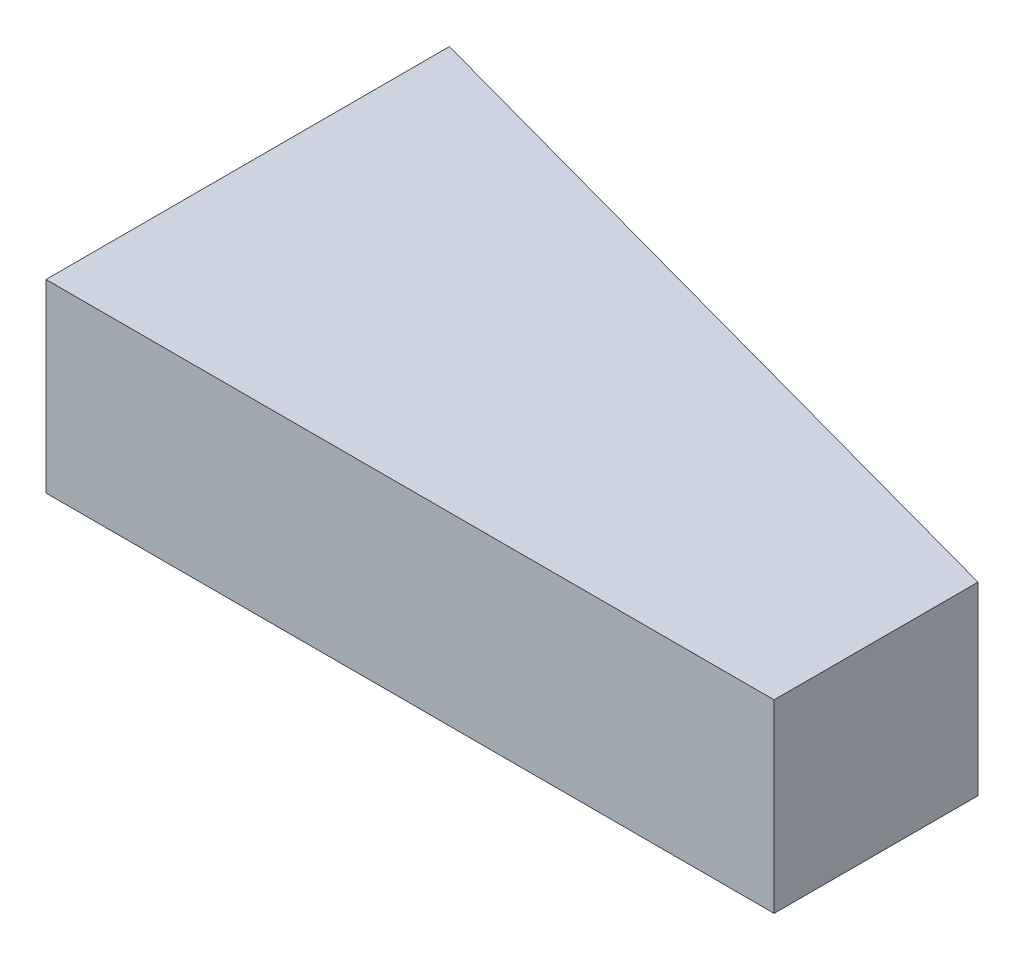
ISO-10303-21;
HEADER;
FILE_DESCRIPTION(('STEP AP214'),'2;1');
FILE_NAME('part.step','',(''),(''),'','','');
FILE_SCHEMA(('AUTOMOTIVE_DESIGN { 1 0 10303 214 1 1 1 1 }'));
ENDSEC;
DATA;
#1=APPLICATION_CONTEXT('core data for automotive mechanical design processes');
#2=APPLICATION_PROTOCOL_DEFINITION('international standard','automotive_design',2000,#1);
#3=PRODUCT_CONTEXT('',#1,'mechanical');
#4=PRODUCT('Part','Part','',(#3));
#5=PRODUCT_RELATED_PRODUCT_CATEGORY('part','',(#4));
#6=PRODUCT_DEFINITION_FORMATION('','',#4);
#7=PRODUCT_DEFINITION_CONTEXT('part definition',#1,'design');
#8=PRODUCT_DEFINITION('design','',#6,#7);
#9=PRODUCT_DEFINITION_SHAPE('','',#8);
#10=(LENGTH_UNIT() NAMED_UNIT(*) SI_UNIT(.MILLI.,.METRE.));
#11=(NAMED_UNIT(*) PLANE_ANGLE_UNIT() SI_UNIT($,.RADIAN.));
#12=(NAMED_UNIT(*) SI_UNIT($,.STERADIAN.) SOLID_ANGLE_UNIT());
#13=UNCERTAINTY_MEASURE_WITH_UNIT(LENGTH_MEASURE(1.E-05),#10,'distance_accuracy_value','');
#14=(GEOMETRIC_REPRESENTATION_CONTEXT(3) GLOBAL_UNCERTAINTY_ASSIGNED_CONTEXT((#13)) GLOBAL_UNIT_ASSIGNED_CONTEXT((#10,
#11,#12)) REPRESENTATION_CONTEXT('',''));
#15=CARTESIAN_POINT('',(0.,0.,0.));
#16=DIRECTION('',(0.,0.,1.));
#17=DIRECTION('',(1.,0.,0.));
#18=AXIS2_PLACEMENT_3D('',#15,#16,#17);
#19=CARTESIAN_POINT('',(100.,25.4,0.));
#20=DIRECTION('',(0.,0.,-1.));
#21=DIRECTION('',(-1.,0.,0.));
#22=AXIS2_PLACEMENT_3D('',#19,#20,#21);
#23=PLANE('',#22);
#24=DIRECTION('',(1.,0.,0.));
#25=VECTOR('',#24,1.);
#26=CARTESIAN_POINT('',(100.,0.,0.));
#27=LINE('',#26,#25);
#28=CARTESIAN_POINT('',(0.,0.,0.));
#29=VERTEX_POINT('',#28);
#30=CARTESIAN_POINT('',(100.,0.,0.));
#31=VERTEX_POINT('',#30);
#32=EDGE_CURVE('E119',#29,#31,#27,.T.);
#33=ORIENTED_EDGE('',*,*,#32,.T.);
#34=DIRECTION('',(0.,-1.,0.));
#35=VECTOR('',#34,1.);
#36=CARTESIAN_POINT('',(100.,25.4,0.));
#37=LINE('',#36,#35);
#38=CARTESIAN_POINT('',(100.,25.4,0.));
#39=VERTEX_POINT('',#38);
#40=EDGE_CURVE('E11',#39,#31,#37,.T.);
#41=ORIENTED_EDGE('',*,*,#40,.F.);
#42=DIRECTION('',(1.,0.,0.));
#43=VECTOR('',#42,1.);
#44=CARTESIAN_POINT('',(100.,25.4,0.));
#45=LINE('',#44,#43);
#46=CARTESIAN_POINT('',(0.,25.4,0.));
#47=VERTEX_POINT('',#46);
#48=EDGE_CURVE('E101',#47,#39,#45,.T.);
#49=ORIENTED_EDGE('',*,*,#48,.F.);
#50=DIRECTION('',(0.,-1.,0.));
#51=VECTOR('',#50,1.);
#52=CARTESIAN_POINT('',(0.,25.4,0.));
#53=LINE('',#52,#51);
#54=EDGE_CURVE('E115',#47,#29,#53,.T.);
#55=ORIENTED_EDGE('',*,*,#54,.T.);
#56=EDGE_LOOP('',(#33,#41,#49,#55));
#57=FACE_BOUND('',#56,.T.);
#58=ADVANCED_FACE('F49',(#57),#23,.F.);
#59=CARTESIAN_POINT('',(100.,25.4,0.));
#60=DIRECTION('',(-1.,0.,0.));
#61=DIRECTION('',(0.,0.,1.));
#62=AXIS2_PLACEMENT_3D('',#59,#60,#61);
#63=PLANE('',#62);
#64=DIRECTION('',(0.,0.,-1.));
#65=VECTOR('',#64,1.);
#66=CARTESIAN_POINT('',(100.,0.,0.));
#67=LINE('',#66,#65);
#68=CARTESIAN_POINT('',(100.,0.,-28.));
#69=VERTEX_POINT('',#68);
#70=EDGE_CURVE('E106',#31,#69,#67,.T.);
#71=ORIENTED_EDGE('',*,*,#70,.T.);
#72=DIRECTION('',(0.,-1.,0.));
#73=VECTOR('',#72,1.);
#74=CARTESIAN_POINT('',(100.,25.4,-28.));
#75=LINE('',#74,#73);
#76=CARTESIAN_POINT('',(100.,25.4,-28.));
#77=VERTEX_POINT('',#76);
#78=EDGE_CURVE('E58',#77,#69,#75,.T.);
#79=ORIENTED_EDGE('',*,*,#78,.F.);
#80=DIRECTION('',(0.,0.,-1.));
#81=VECTOR('',#80,1.);
#82=CARTESIAN_POINT('',(100.,25.4,0.));
#83=LINE('',#82,#81);
#84=EDGE_CURVE('E96',#39,#77,#83,.T.);
#85=ORIENTED_EDGE('',*,*,#84,.F.);
#86=ORIENTED_EDGE('',*,*,#40,.T.);
#87=EDGE_LOOP('',(#71,#79,#85,#86));
#88=FACE_BOUND('',#87,.T.);
#89=ADVANCED_FACE('F105',(#88),#63,.F.);
#90=CARTESIAN_POINT('',(100.,25.4,-28.));
#91=DIRECTION('',(-0.264259725440466,0.,0.964451552702431));
#92=DIRECTION('',(0.964451552702431,0.,0.264259725440466));
#93=AXIS2_PLACEMENT_3D('',#90,#91,#92);
#94=PLANE('',#93);
#95=DIRECTION('',(-0.964451552702431,0.,-0.264259725440466));
#96=VECTOR('',#95,1.);
#97=CARTESIAN_POINT('',(100.,0.,-28.));
#98=LINE('',#97,#96);
#99=CARTESIAN_POINT('',(0.,0.,-55.4));
#100=VERTEX_POINT('',#99);
#101=EDGE_CURVE('E83',#69,#100,#98,.T.);
#102=ORIENTED_EDGE('',*,*,#101,.T.);
#103=DIRECTION('',(0.,-1.,0.));
#104=VECTOR('',#103,1.);
#105=CARTESIAN_POINT('',(0.,25.4,-55.4));
#106=LINE('',#105,#104);
#107=CARTESIAN_POINT('',(0.,25.4,-55.4));
#108=VERTEX_POINT('',#107);
#109=EDGE_CURVE('E108',#108,#100,#106,.T.);
#110=ORIENTED_EDGE('',*,*,#109,.F.);
#111=DIRECTION('',(-0.964451552702431,0.,-0.264259725440466));
#112=VECTOR('',#111,1.);
#113=CARTESIAN_POINT('',(100.,25.4,-28.));
#114=LINE('',#113,#112);
#115=EDGE_CURVE('E99',#77,#108,#114,.T.);
#116=ORIENTED_EDGE('',*,*,#115,.F.);
#117=ORIENTED_EDGE('',*,*,#78,.T.);
#118=EDGE_LOOP('',(#102,#110,#116,#117));
#119=FACE_BOUND('',#118,.T.);
#120=ADVANCED_FACE('F109',(#119),#94,.F.);
#121=CARTESIAN_POINT('',(0.,25.4,0.));
#122=DIRECTION('',(1.,0.,0.));
#123=DIRECTION('',(0.,0.,-1.));
#124=AXIS2_PLACEMENT_3D('',#121,#122,#123);
#125=PLANE('',#124);
#126=DIRECTION('',(0.,0.,1.));
#127=VECTOR('',#126,1.);
#128=CARTESIAN_POINT('',(0.,0.,0.));
#129=LINE('',#128,#127);
#130=EDGE_CURVE('E89',#100,#29,#129,.T.);
#131=ORIENTED_EDGE('',*,*,#130,.T.);
#132=ORIENTED_EDGE('',*,*,#54,.F.);
#133=DIRECTION('',(0.,0.,1.));
#134=VECTOR('',#133,1.);
#135=CARTESIAN_POINT('',(0.,25.4,0.));
#136=LINE('',#135,#134);
#137=EDGE_CURVE('E66',#108,#47,#136,.T.);
#138=ORIENTED_EDGE('',*,*,#137,.F.);
#139=ORIENTED_EDGE('',*,*,#109,.T.);
#140=EDGE_LOOP('',(#131,#132,#138,#139));
#141=FACE_BOUND('',#140,.T.);
#142=ADVANCED_FACE('F132',(#141),#125,.F.);
#143=CARTESIAN_POINT('',(0.,25.4,0.));
#144=DIRECTION('',(0.,-1.,0.));
#145=DIRECTION('',(0.,0.,-1.));
#146=AXIS2_PLACEMENT_3D('',#143,#144,#145);
#147=PLANE('',#146);
#148=ORIENTED_EDGE('',*,*,#48,.T.);
#149=ORIENTED_EDGE('',*,*,#84,.T.);
#150=ORIENTED_EDGE('',*,*,#115,.T.);
#151=ORIENTED_EDGE('',*,*,#137,.T.);
#152=EDGE_LOOP('',(#148,#149,#150,#151));
#153=FACE_BOUND('',#152,.T.);
#154=ADVANCED_FACE('F97',(#153),#147,.F.);
#155=CARTESIAN_POINT('',(0.,0.,0.));
#156=DIRECTION('',(0.,-1.,0.));
#157=DIRECTION('',(0.,0.,-1.));
#158=AXIS2_PLACEMENT_3D('',#155,#156,#157);
#159=PLANE('',#158);
#160=ORIENTED_EDGE('',*,*,#32,.F.);
#161=ORIENTED_EDGE('',*,*,#130,.F.);
#162=ORIENTED_EDGE('',*,*,#101,.F.);
#163=ORIENTED_EDGE('',*,*,#70,.F.);
#164=EDGE_LOOP('',(#160,#161,#162,#163));
#165=FACE_BOUND('',#164,.T.);
#166=ADVANCED_FACE('F135',(#165),#159,.T.);
#167=CLOSED_SHELL('',(#58,#89,#120,#142,#154,#166));
#168=MANIFOLD_SOLID_BREP('B2',#167);
#169=ADVANCED_BREP_SHAPE_REPRESENTATION('',(#18,#168),#14);
#170=SHAPE_DEFINITION_REPRESENTATION(#9,#169);
ENDSEC;
END-ISO-10303-21;
